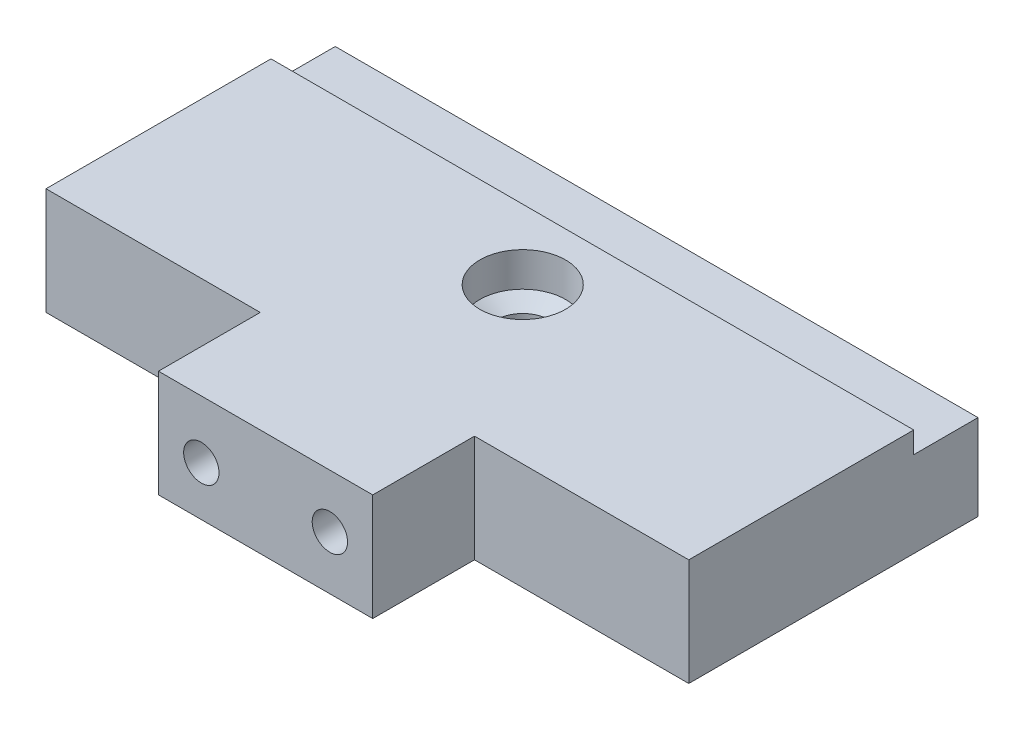
ISO-10303-21;
HEADER;
FILE_DESCRIPTION(('STEP AP214'),'2;1');
FILE_NAME('part.step','',(''),(''),'','','');
FILE_SCHEMA(('AUTOMOTIVE_DESIGN { 1 0 10303 214 1 1 1 1 }'));
ENDSEC;
DATA;
#1=APPLICATION_CONTEXT('core data for automotive mechanical design processes');
#2=APPLICATION_PROTOCOL_DEFINITION('international standard','automotive_design',2000,#1);
#3=PRODUCT_CONTEXT('',#1,'mechanical');
#4=PRODUCT('Part','Part','',(#3));
#5=PRODUCT_RELATED_PRODUCT_CATEGORY('part','',(#4));
#6=PRODUCT_DEFINITION_FORMATION('','',#4);
#7=PRODUCT_DEFINITION_CONTEXT('part definition',#1,'design');
#8=PRODUCT_DEFINITION('design','',#6,#7);
#9=PRODUCT_DEFINITION_SHAPE('','',#8);
#10=(LENGTH_UNIT() NAMED_UNIT(*) SI_UNIT(.MILLI.,.METRE.));
#11=(NAMED_UNIT(*) PLANE_ANGLE_UNIT() SI_UNIT($,.RADIAN.));
#12=(NAMED_UNIT(*) SI_UNIT($,.STERADIAN.) SOLID_ANGLE_UNIT());
#13=UNCERTAINTY_MEASURE_WITH_UNIT(LENGTH_MEASURE(1.E-05),#10,'distance_accuracy_value','');
#14=(GEOMETRIC_REPRESENTATION_CONTEXT(3) GLOBAL_UNCERTAINTY_ASSIGNED_CONTEXT((#13)) GLOBAL_UNIT_ASSIGNED_CONTEXT((#10,
#11,#12)) REPRESENTATION_CONTEXT('',''));
#15=CARTESIAN_POINT('',(0.,0.,0.));
#16=DIRECTION('',(0.,0.,1.));
#17=DIRECTION('',(1.,0.,0.));
#18=AXIS2_PLACEMENT_3D('',#15,#16,#17);
#19=CARTESIAN_POINT('',(0.,10.,0.));
#20=DIRECTION('',(0.,0.,-1.));
#21=DIRECTION('',(-1.,0.,0.));
#22=AXIS2_PLACEMENT_3D('',#19,#20,#21);
#23=PLANE('',#22);
#24=CARTESIAN_POINT('',(16.,5.00694727949025,0.));
#25=DIRECTION('',(0.,0.,1.));
#26=DIRECTION('',(1.,0.,0.));
#27=AXIS2_PLACEMENT_3D('',#24,#25,#26);
#28=CIRCLE('',#27,1.64999999999999);
#29=CARTESIAN_POINT('',(17.65,5.00694727949025,0.));
#30=VERTEX_POINT('',#29);
#31=EDGE_CURVE('E194',#30,#30,#28,.T.);
#32=ORIENTED_EDGE('',*,*,#31,.F.);
#33=EDGE_LOOP('',(#32));
#34=FACE_BOUND('',#33,.T.);
#35=CARTESIAN_POINT('',(4.,4.60497799052106,0.));
#36=DIRECTION('',(0.,0.,1.));
#37=DIRECTION('',(1.,0.,0.));
#38=AXIS2_PLACEMENT_3D('',#35,#36,#37);
#39=CIRCLE('',#38,1.64999999999999);
#40=CARTESIAN_POINT('',(5.64999999999999,4.60497799052106,0.));
#41=VERTEX_POINT('',#40);
#42=EDGE_CURVE('E188',#41,#41,#39,.T.);
#43=ORIENTED_EDGE('',*,*,#42,.F.);
#44=EDGE_LOOP('',(#43));
#45=FACE_BOUND('',#44,.T.);
#46=DIRECTION('',(1.,0.,0.));
#47=VECTOR('',#46,1.);
#48=CARTESIAN_POINT('',(0.,0.,0.));
#49=LINE('',#48,#47);
#50=CARTESIAN_POINT('',(0.,0.,0.));
#51=VERTEX_POINT('',#50);
#52=CARTESIAN_POINT('',(20.,0.,0.));
#53=VERTEX_POINT('',#52);
#54=EDGE_CURVE('E155',#51,#53,#49,.T.);
#55=ORIENTED_EDGE('',*,*,#54,.T.);
#56=DIRECTION('',(0.,-1.,0.));
#57=VECTOR('',#56,1.);
#58=CARTESIAN_POINT('',(20.,10.,0.));
#59=LINE('',#58,#57);
#60=CARTESIAN_POINT('',(20.,10.,0.));
#61=VERTEX_POINT('',#60);
#62=EDGE_CURVE('E11',#61,#53,#59,.T.);
#63=ORIENTED_EDGE('',*,*,#62,.F.);
#64=DIRECTION('',(1.,0.,0.));
#65=VECTOR('',#64,1.);
#66=CARTESIAN_POINT('',(0.,10.,0.));
#67=LINE('',#66,#65);
#68=CARTESIAN_POINT('',(0.,10.,0.));
#69=VERTEX_POINT('',#68);
#70=EDGE_CURVE('E148',#69,#61,#67,.T.);
#71=ORIENTED_EDGE('',*,*,#70,.F.);
#72=DIRECTION('',(0.,-1.,0.));
#73=VECTOR('',#72,1.);
#74=CARTESIAN_POINT('',(0.,10.,0.));
#75=LINE('',#74,#73);
#76=EDGE_CURVE('E62',#69,#51,#75,.T.);
#77=ORIENTED_EDGE('',*,*,#76,.T.);
#78=EDGE_LOOP('',(#55,#63,#71,#77));
#79=FACE_BOUND('',#78,.T.);
#80=ADVANCED_FACE('F38',(#34,#45,#79),#23,.F.);
#81=CARTESIAN_POINT('',(20.,10.,0.));
#82=DIRECTION('',(-1.,0.,0.));
#83=DIRECTION('',(0.,0.,1.));
#84=AXIS2_PLACEMENT_3D('',#81,#82,#83);
#85=PLANE('',#84);
#86=DIRECTION('',(0.,0.,-1.));
#87=VECTOR('',#86,1.);
#88=CARTESIAN_POINT('',(20.,0.,0.));
#89=LINE('',#88,#87);
#90=CARTESIAN_POINT('',(20.,0.,-9.50000000000001));
#91=VERTEX_POINT('',#90);
#92=EDGE_CURVE('E207',#53,#91,#89,.T.);
#93=ORIENTED_EDGE('',*,*,#92,.T.);
#94=DIRECTION('',(0.,-1.,0.));
#95=VECTOR('',#94,1.);
#96=CARTESIAN_POINT('',(20.,10.,-9.50000000000001));
#97=LINE('',#96,#95);
#98=CARTESIAN_POINT('',(20.,10.,-9.50000000000001));
#99=VERTEX_POINT('',#98);
#100=EDGE_CURVE('E46',#99,#91,#97,.T.);
#101=ORIENTED_EDGE('',*,*,#100,.F.);
#102=DIRECTION('',(0.,0.,-1.));
#103=VECTOR('',#102,1.);
#104=CARTESIAN_POINT('',(20.,10.,0.));
#105=LINE('',#104,#103);
#106=EDGE_CURVE('E95',#61,#99,#105,.T.);
#107=ORIENTED_EDGE('',*,*,#106,.F.);
#108=ORIENTED_EDGE('',*,*,#62,.T.);
#109=EDGE_LOOP('',(#93,#101,#107,#108));
#110=FACE_BOUND('',#109,.T.);
#111=ADVANCED_FACE('F202',(#110),#85,.F.);
#112=CARTESIAN_POINT('',(0.,10.,-9.50000000000001));
#113=DIRECTION('',(0.,0.,-1.));
#114=DIRECTION('',(-1.,0.,0.));
#115=AXIS2_PLACEMENT_3D('',#112,#113,#114);
#116=PLANE('',#115);
#117=DIRECTION('',(1.,0.,0.));
#118=VECTOR('',#117,1.);
#119=CARTESIAN_POINT('',(0.,0.,-9.50000000000001));
#120=LINE('',#119,#118);
#121=CARTESIAN_POINT('',(40.,0.,-9.50000000000002));
#122=VERTEX_POINT('',#121);
#123=EDGE_CURVE('E209',#91,#122,#120,.T.);
#124=ORIENTED_EDGE('',*,*,#123,.T.);
#125=DIRECTION('',(0.,-1.,0.));
#126=VECTOR('',#125,1.);
#127=CARTESIAN_POINT('',(40.,10.,-9.50000000000002));
#128=LINE('',#127,#126);
#129=CARTESIAN_POINT('',(40.,10.,-9.50000000000002));
#130=VERTEX_POINT('',#129);
#131=EDGE_CURVE('E225',#130,#122,#128,.T.);
#132=ORIENTED_EDGE('',*,*,#131,.F.);
#133=DIRECTION('',(1.,0.,0.));
#134=VECTOR('',#133,1.);
#135=CARTESIAN_POINT('',(0.,10.,-9.50000000000001));
#136=LINE('',#135,#134);
#137=EDGE_CURVE('E141',#99,#130,#136,.T.);
#138=ORIENTED_EDGE('',*,*,#137,.F.);
#139=ORIENTED_EDGE('',*,*,#100,.T.);
#140=EDGE_LOOP('',(#124,#132,#138,#139));
#141=FACE_BOUND('',#140,.T.);
#142=ADVANCED_FACE('F231',(#141),#116,.F.);
#143=CARTESIAN_POINT('',(40.,10.,0.));
#144=DIRECTION('',(-1.,0.,0.));
#145=DIRECTION('',(0.,0.,1.));
#146=AXIS2_PLACEMENT_3D('',#143,#144,#145);
#147=PLANE('',#146);
#148=DIRECTION('',(0.,0.,-1.));
#149=VECTOR('',#148,1.);
#150=CARTESIAN_POINT('',(40.,0.,0.));
#151=LINE('',#150,#149);
#152=CARTESIAN_POINT('',(40.,0.,-36.5));
#153=VERTEX_POINT('',#152);
#154=EDGE_CURVE('E213',#122,#153,#151,.T.);
#155=ORIENTED_EDGE('',*,*,#154,.T.);
#156=DIRECTION('',(0.,-1.,0.));
#157=VECTOR('',#156,1.);
#158=CARTESIAN_POINT('',(40.,8.,-36.5));
#159=LINE('',#158,#157);
#160=CARTESIAN_POINT('',(40.,8.,-36.5));
#161=VERTEX_POINT('',#160);
#162=EDGE_CURVE('E152',#161,#153,#159,.T.);
#163=ORIENTED_EDGE('',*,*,#162,.F.);
#164=DIRECTION('',(0.,0.,-1.));
#165=VECTOR('',#164,1.);
#166=CARTESIAN_POINT('',(40.,8.,0.));
#167=LINE('',#166,#165);
#168=CARTESIAN_POINT('',(40.,8.,-30.5));
#169=VERTEX_POINT('',#168);
#170=EDGE_CURVE('E167',#169,#161,#167,.T.);
#171=ORIENTED_EDGE('',*,*,#170,.F.);
#172=DIRECTION('',(0.,-1.,0.));
#173=VECTOR('',#172,1.);
#174=CARTESIAN_POINT('',(40.,10.,-30.5));
#175=LINE('',#174,#173);
#176=CARTESIAN_POINT('',(40.,10.,-30.5));
#177=VERTEX_POINT('',#176);
#178=EDGE_CURVE('E222',#177,#169,#175,.T.);
#179=ORIENTED_EDGE('',*,*,#178,.F.);
#180=DIRECTION('',(0.,0.,-1.));
#181=VECTOR('',#180,1.);
#182=CARTESIAN_POINT('',(40.,10.,0.));
#183=LINE('',#182,#181);
#184=EDGE_CURVE('E145',#130,#177,#183,.T.);
#185=ORIENTED_EDGE('',*,*,#184,.F.);
#186=ORIENTED_EDGE('',*,*,#131,.T.);
#187=EDGE_LOOP('',(#155,#163,#171,#179,#185,#186));
#188=FACE_BOUND('',#187,.T.);
#189=ADVANCED_FACE('F238',(#188),#147,.F.);
#190=CARTESIAN_POINT('',(0.,10.,-30.5));
#191=DIRECTION('',(0.,0.,1.));
#192=DIRECTION('',(1.,0.,0.));
#193=AXIS2_PLACEMENT_3D('',#190,#191,#192);
#194=PLANE('',#193);
#195=ORIENTED_EDGE('',*,*,#178,.T.);
#196=DIRECTION('',(-1.,0.,0.));
#197=VECTOR('',#196,1.);
#198=CARTESIAN_POINT('',(0.,8.,-30.5));
#199=LINE('',#198,#197);
#200=CARTESIAN_POINT('',(-20.,8.,-30.5));
#201=VERTEX_POINT('',#200);
#202=EDGE_CURVE('E161',#169,#201,#199,.T.);
#203=ORIENTED_EDGE('',*,*,#202,.T.);
#204=DIRECTION('',(0.,-1.,0.));
#205=VECTOR('',#204,1.);
#206=CARTESIAN_POINT('',(-20.,10.,-30.5));
#207=LINE('',#206,#205);
#208=CARTESIAN_POINT('',(-20.,10.,-30.5));
#209=VERTEX_POINT('',#208);
#210=EDGE_CURVE('E135',#209,#201,#207,.T.);
#211=ORIENTED_EDGE('',*,*,#210,.F.);
#212=DIRECTION('',(-1.,0.,0.));
#213=VECTOR('',#212,1.);
#214=CARTESIAN_POINT('',(0.,10.,-30.5));
#215=LINE('',#214,#213);
#216=EDGE_CURVE('E121',#177,#209,#215,.T.);
#217=ORIENTED_EDGE('',*,*,#216,.F.);
#218=EDGE_LOOP('',(#195,#203,#211,#217));
#219=FACE_BOUND('',#218,.T.);
#220=ADVANCED_FACE('F251',(#219),#194,.F.);
#221=CARTESIAN_POINT('',(-20.,10.,0.));
#222=DIRECTION('',(1.,0.,0.));
#223=DIRECTION('',(0.,0.,-1.));
#224=AXIS2_PLACEMENT_3D('',#221,#222,#223);
#225=PLANE('',#224);
#226=DIRECTION('',(0.,0.,1.));
#227=VECTOR('',#226,1.);
#228=CARTESIAN_POINT('',(-20.,0.,0.));
#229=LINE('',#228,#227);
#230=CARTESIAN_POINT('',(-20.,0.,-36.5));
#231=VERTEX_POINT('',#230);
#232=CARTESIAN_POINT('',(-20.,0.,-9.50000000000001));
#233=VERTEX_POINT('',#232);
#234=EDGE_CURVE('E131',#231,#233,#229,.T.);
#235=ORIENTED_EDGE('',*,*,#234,.T.);
#236=DIRECTION('',(0.,-1.,0.));
#237=VECTOR('',#236,1.);
#238=CARTESIAN_POINT('',(-20.,10.,-9.50000000000001));
#239=LINE('',#238,#237);
#240=CARTESIAN_POINT('',(-20.,10.,-9.50000000000001));
#241=VERTEX_POINT('',#240);
#242=EDGE_CURVE('E127',#241,#233,#239,.T.);
#243=ORIENTED_EDGE('',*,*,#242,.F.);
#244=DIRECTION('',(0.,0.,1.));
#245=VECTOR('',#244,1.);
#246=CARTESIAN_POINT('',(-20.,10.,0.));
#247=LINE('',#246,#245);
#248=EDGE_CURVE('E113',#209,#241,#247,.T.);
#249=ORIENTED_EDGE('',*,*,#248,.F.);
#250=ORIENTED_EDGE('',*,*,#210,.T.);
#251=DIRECTION('',(0.,0.,-1.));
#252=VECTOR('',#251,1.);
#253=CARTESIAN_POINT('',(-20.,8.,0.));
#254=LINE('',#253,#252);
#255=CARTESIAN_POINT('',(-20.,8.,-36.5));
#256=VERTEX_POINT('',#255);
#257=EDGE_CURVE('E53',#201,#256,#254,.T.);
#258=ORIENTED_EDGE('',*,*,#257,.T.);
#259=DIRECTION('',(0.,-1.,0.));
#260=VECTOR('',#259,1.);
#261=CARTESIAN_POINT('',(-20.,8.,-36.5));
#262=LINE('',#261,#260);
#263=EDGE_CURVE('E156',#256,#231,#262,.T.);
#264=ORIENTED_EDGE('',*,*,#263,.T.);
#265=EDGE_LOOP('',(#235,#243,#249,#250,#258,#264));
#266=FACE_BOUND('',#265,.T.);
#267=ADVANCED_FACE('F128',(#266),#225,.F.);
#268=CARTESIAN_POINT('',(0.,0.,-9.50000000000001));
#269=VERTEX_POINT('',#268);
#270=EDGE_CURVE('E214',#233,#269,#120,.T.);
#271=ORIENTED_EDGE('',*,*,#270,.T.);
#272=DIRECTION('',(0.,-1.,0.));
#273=VECTOR('',#272,1.);
#274=CARTESIAN_POINT('',(0.,10.,-9.50000000000001));
#275=LINE('',#274,#273);
#276=CARTESIAN_POINT('',(0.,10.,-9.50000000000001));
#277=VERTEX_POINT('',#276);
#278=EDGE_CURVE('E136',#277,#269,#275,.T.);
#279=ORIENTED_EDGE('',*,*,#278,.F.);
#280=EDGE_CURVE('E118',#241,#277,#136,.T.);
#281=ORIENTED_EDGE('',*,*,#280,.F.);
#282=ORIENTED_EDGE('',*,*,#242,.T.);
#283=EDGE_LOOP('',(#271,#279,#281,#282));
#284=FACE_BOUND('',#283,.T.);
#285=ADVANCED_FACE('F138',(#284),#116,.F.);
#286=CARTESIAN_POINT('',(0.,10.,0.));
#287=DIRECTION('',(-1.,0.,0.));
#288=DIRECTION('',(0.,0.,1.));
#289=AXIS2_PLACEMENT_3D('',#286,#287,#288);
#290=PLANE('',#289);
#291=DIRECTION('',(0.,0.,-1.));
#292=VECTOR('',#291,1.);
#293=CARTESIAN_POINT('',(0.,0.,0.));
#294=LINE('',#293,#292);
#295=EDGE_CURVE('E149',#51,#269,#294,.T.);
#296=ORIENTED_EDGE('',*,*,#295,.F.);
#297=ORIENTED_EDGE('',*,*,#76,.F.);
#298=DIRECTION('',(0.,0.,-1.));
#299=VECTOR('',#298,1.);
#300=CARTESIAN_POINT('',(0.,10.,0.));
#301=LINE('',#300,#299);
#302=EDGE_CURVE('E139',#69,#277,#301,.T.);
#303=ORIENTED_EDGE('',*,*,#302,.T.);
#304=ORIENTED_EDGE('',*,*,#278,.T.);
#305=EDGE_LOOP('',(#296,#297,#303,#304));
#306=FACE_BOUND('',#305,.T.);
#307=ADVANCED_FACE('F305',(#306),#290,.T.);
#308=CARTESIAN_POINT('',(0.,10.,0.));
#309=DIRECTION('',(0.,1.,0.));
#310=DIRECTION('',(0.,0.,1.));
#311=AXIS2_PLACEMENT_3D('',#308,#309,#310);
#312=PLANE('',#311);
#313=CARTESIAN_POINT('',(9.99999999999999,10.,-24.));
#314=DIRECTION('',(0.,1.,0.));
#315=DIRECTION('',(0.,0.,1.));
#316=AXIS2_PLACEMENT_3D('',#313,#314,#315);
#317=CIRCLE('',#316,3.99999999999999);
#318=CARTESIAN_POINT('',(9.99999999999999,10.,-20.));
#319=VERTEX_POINT('',#318);
#320=EDGE_CURVE('E173',#319,#319,#317,.T.);
#321=ORIENTED_EDGE('',*,*,#320,.F.);
#322=EDGE_LOOP('',(#321));
#323=FACE_BOUND('',#322,.T.);
#324=ORIENTED_EDGE('',*,*,#70,.T.);
#325=ORIENTED_EDGE('',*,*,#106,.T.);
#326=ORIENTED_EDGE('',*,*,#137,.T.);
#327=ORIENTED_EDGE('',*,*,#184,.T.);
#328=ORIENTED_EDGE('',*,*,#216,.T.);
#329=ORIENTED_EDGE('',*,*,#248,.T.);
#330=ORIENTED_EDGE('',*,*,#280,.T.);
#331=ORIENTED_EDGE('',*,*,#302,.F.);
#332=EDGE_LOOP('',(#324,#325,#326,#327,#328,#329,#330,#331));
#333=FACE_BOUND('',#332,.T.);
#334=ADVANCED_FACE('F115',(#323,#333),#312,.T.);
#335=CARTESIAN_POINT('',(0.,0.,0.));
#336=DIRECTION('',(0.,1.,0.));
#337=DIRECTION('',(0.,0.,1.));
#338=AXIS2_PLACEMENT_3D('',#335,#336,#337);
#339=PLANE('',#338);
#340=CARTESIAN_POINT('',(9.99999999999999,0.,-24.));
#341=DIRECTION('',(0.,-1.,0.));
#342=DIRECTION('',(0.,0.,-1.));
#343=AXIS2_PLACEMENT_3D('',#340,#341,#342);
#344=CIRCLE('',#343,3.99999999999999);
#345=CARTESIAN_POINT('',(9.99999999999999,0.,-28.));
#346=VERTEX_POINT('',#345);
#347=EDGE_CURVE('E179',#346,#346,#344,.T.);
#348=ORIENTED_EDGE('',*,*,#347,.F.);
#349=EDGE_LOOP('',(#348));
#350=FACE_BOUND('',#349,.T.);
#351=ORIENTED_EDGE('',*,*,#54,.F.);
#352=ORIENTED_EDGE('',*,*,#295,.T.);
#353=ORIENTED_EDGE('',*,*,#270,.F.);
#354=ORIENTED_EDGE('',*,*,#234,.F.);
#355=DIRECTION('',(1.,0.,0.));
#356=VECTOR('',#355,1.);
#357=CARTESIAN_POINT('',(0.,0.,-36.5));
#358=LINE('',#357,#356);
#359=EDGE_CURVE('E158',#231,#153,#358,.T.);
#360=ORIENTED_EDGE('',*,*,#359,.T.);
#361=ORIENTED_EDGE('',*,*,#154,.F.);
#362=ORIENTED_EDGE('',*,*,#123,.F.);
#363=ORIENTED_EDGE('',*,*,#92,.F.);
#364=EDGE_LOOP('',(#351,#352,#353,#354,#360,#361,#362,#363));
#365=FACE_BOUND('',#364,.T.);
#366=ADVANCED_FACE('F233',(#350,#365),#339,.F.);
#367=CARTESIAN_POINT('',(0.,8.,-36.5));
#368=DIRECTION('',(0.,0.,-1.));
#369=DIRECTION('',(-1.,0.,0.));
#370=AXIS2_PLACEMENT_3D('',#367,#368,#369);
#371=PLANE('',#370);
#372=ORIENTED_EDGE('',*,*,#359,.F.);
#373=ORIENTED_EDGE('',*,*,#263,.F.);
#374=DIRECTION('',(1.,0.,0.));
#375=VECTOR('',#374,1.);
#376=CARTESIAN_POINT('',(0.,8.,-36.5));
#377=LINE('',#376,#375);
#378=EDGE_CURVE('E164',#256,#161,#377,.T.);
#379=ORIENTED_EDGE('',*,*,#378,.T.);
#380=ORIENTED_EDGE('',*,*,#162,.T.);
#381=EDGE_LOOP('',(#372,#373,#379,#380));
#382=FACE_BOUND('',#381,.T.);
#383=ADVANCED_FACE('F244',(#382),#371,.T.);
#384=CARTESIAN_POINT('',(0.,8.,0.));
#385=DIRECTION('',(0.,1.,0.));
#386=DIRECTION('',(0.,0.,1.));
#387=AXIS2_PLACEMENT_3D('',#384,#385,#386);
#388=PLANE('',#387);
#389=ORIENTED_EDGE('',*,*,#202,.F.);
#390=ORIENTED_EDGE('',*,*,#170,.T.);
#391=ORIENTED_EDGE('',*,*,#378,.F.);
#392=ORIENTED_EDGE('',*,*,#257,.F.);
#393=EDGE_LOOP('',(#389,#390,#391,#392));
#394=FACE_BOUND('',#393,.T.);
#395=ADVANCED_FACE('F248',(#394),#388,.T.);
#396=CARTESIAN_POINT('',(9.99999999999999,6.8,-24.));
#397=DIRECTION('',(0.,1.,0.));
#398=DIRECTION('',(0.,0.,1.));
#399=AXIS2_PLACEMENT_3D('',#396,#397,#398);
#400=CONICAL_SURFACE('',#399,3.99999999999999,1.02974425867666);
#401=CARTESIAN_POINT('',(9.99999999999999,5.89870907145867,-24.));
#402=DIRECTION('',(0.,1.,0.));
#403=DIRECTION('',(0.,0.,1.));
#404=AXIS2_PLACEMENT_3D('',#401,#402,#403);
#405=CIRCLE('',#404,2.49999999999999);
#406=CARTESIAN_POINT('',(9.99999999999999,5.89870907145867,-21.5));
#407=VERTEX_POINT('',#406);
#408=EDGE_CURVE('E41',#407,#407,#405,.F.);
#409=ORIENTED_EDGE('',*,*,#408,.T.);
#410=EDGE_LOOP('',(#409));
#411=FACE_BOUND('',#410,.T.);
#412=CARTESIAN_POINT('',(9.99999999999999,6.8,-24.));
#413=DIRECTION('',(0.,1.,0.));
#414=DIRECTION('',(0.,0.,1.));
#415=AXIS2_PLACEMENT_3D('',#412,#413,#414);
#416=CIRCLE('',#415,3.99999999999999);
#417=CARTESIAN_POINT('',(9.99999999999999,6.8,-20.));
#418=VERTEX_POINT('',#417);
#419=EDGE_CURVE('E162',#418,#418,#416,.T.);
#420=ORIENTED_EDGE('',*,*,#419,.T.);
#421=EDGE_LOOP('',(#420));
#422=FACE_BOUND('',#421,.T.);
#423=ADVANCED_FACE('F294',(#411,#422),#400,.F.);
#424=CARTESIAN_POINT('',(9.99999999999999,10.,-24.));
#425=DIRECTION('',(0.,1.,0.));
#426=DIRECTION('',(0.,0.,1.));
#427=AXIS2_PLACEMENT_3D('',#424,#425,#426);
#428=CYLINDRICAL_SURFACE('',#427,3.99999999999999);
#429=ORIENTED_EDGE('',*,*,#419,.F.);
#430=EDGE_LOOP('',(#429));
#431=FACE_BOUND('',#430,.T.);
#432=ORIENTED_EDGE('',*,*,#320,.T.);
#433=EDGE_LOOP('',(#432));
#434=FACE_BOUND('',#433,.T.);
#435=ADVANCED_FACE('F290',(#431,#434),#428,.F.);
#436=CARTESIAN_POINT('',(9.99999999999999,3.,-24.));
#437=DIRECTION('',(0.,-1.,0.));
#438=DIRECTION('',(0.,0.,-1.));
#439=AXIS2_PLACEMENT_3D('',#436,#437,#438);
#440=CONICAL_SURFACE('',#439,4.,1.02974425867665);
#441=CARTESIAN_POINT('',(9.99999999999999,3.90129092854135,-24.));
#442=DIRECTION('',(0.,-1.,0.));
#443=DIRECTION('',(0.,0.,-1.));
#444=AXIS2_PLACEMENT_3D('',#441,#442,#443);
#445=CIRCLE('',#444,2.49999999999999);
#446=CARTESIAN_POINT('',(9.99999999999999,3.90129092854135,-26.5));
#447=VERTEX_POINT('',#446);
#448=EDGE_CURVE('E182',#447,#447,#445,.F.);
#449=ORIENTED_EDGE('',*,*,#448,.T.);
#450=EDGE_LOOP('',(#449));
#451=FACE_BOUND('',#450,.T.);
#452=CARTESIAN_POINT('',(9.99999999999999,3.,-24.));
#453=DIRECTION('',(0.,-1.,0.));
#454=DIRECTION('',(0.,0.,-1.));
#455=AXIS2_PLACEMENT_3D('',#452,#453,#454);
#456=CIRCLE('',#455,4.);
#457=CARTESIAN_POINT('',(9.99999999999999,3.,-28.));
#458=VERTEX_POINT('',#457);
#459=EDGE_CURVE('E176',#458,#458,#456,.T.);
#460=ORIENTED_EDGE('',*,*,#459,.T.);
#461=EDGE_LOOP('',(#460));
#462=FACE_BOUND('',#461,.T.);
#463=ADVANCED_FACE('F286',(#451,#462),#440,.F.);
#464=CARTESIAN_POINT('',(9.99999999999999,0.,-24.));
#465=DIRECTION('',(0.,-1.,0.));
#466=DIRECTION('',(0.,0.,-1.));
#467=AXIS2_PLACEMENT_3D('',#464,#465,#466);
#468=CYLINDRICAL_SURFACE('',#467,3.99999999999999);
#469=ORIENTED_EDGE('',*,*,#459,.F.);
#470=EDGE_LOOP('',(#469));
#471=FACE_BOUND('',#470,.T.);
#472=ORIENTED_EDGE('',*,*,#347,.T.);
#473=EDGE_LOOP('',(#472));
#474=FACE_BOUND('',#473,.T.);
#475=ADVANCED_FACE('F282',(#471,#474),#468,.F.);
#476=CARTESIAN_POINT('',(9.99999999999999,0.,-24.));
#477=DIRECTION('',(0.,-1.,0.));
#478=DIRECTION('',(0.,0.,-1.));
#479=AXIS2_PLACEMENT_3D('',#476,#477,#478);
#480=CYLINDRICAL_SURFACE('',#479,2.49999999999999);
#481=ORIENTED_EDGE('',*,*,#408,.F.);
#482=EDGE_LOOP('',(#481));
#483=FACE_BOUND('',#482,.T.);
#484=ORIENTED_EDGE('',*,*,#448,.F.);
#485=EDGE_LOOP('',(#484));
#486=FACE_BOUND('',#485,.T.);
#487=ADVANCED_FACE('F278',(#483,#486),#480,.F.);
#488=CARTESIAN_POINT('',(4.,4.60497799052106,-10.1));
#489=DIRECTION('',(0.,0.,1.));
#490=DIRECTION('',(1.,0.,0.));
#491=AXIS2_PLACEMENT_3D('',#488,#489,#490);
#492=CONICAL_SURFACE('',#491,1.64999999999999,1.02974425867665);
#493=CARTESIAN_POINT('',(4.,4.60497799052106,-11.0914200213955));
#494=VERTEX_POINT('',#493);
#495=VERTEX_LOOP('',#494);
#496=FACE_BOUND('',#495,.T.);
#497=CARTESIAN_POINT('',(4.,4.60497799052106,-10.1));
#498=DIRECTION('',(0.,0.,1.));
#499=DIRECTION('',(1.,0.,0.));
#500=AXIS2_PLACEMENT_3D('',#497,#498,#499);
#501=CIRCLE('',#500,1.64999999999999);
#502=CARTESIAN_POINT('',(5.64999999999999,4.60497799052106,-10.1));
#503=VERTEX_POINT('',#502);
#504=EDGE_CURVE('E185',#503,#503,#501,.T.);
#505=ORIENTED_EDGE('',*,*,#504,.T.);
#506=EDGE_LOOP('',(#505));
#507=FACE_BOUND('',#506,.T.);
#508=ADVANCED_FACE('F274',(#496,#507),#492,.F.);
#509=CARTESIAN_POINT('',(4.,4.60497799052106,0.));
#510=DIRECTION('',(0.,0.,1.));
#511=DIRECTION('',(1.,0.,0.));
#512=AXIS2_PLACEMENT_3D('',#509,#510,#511);
#513=CYLINDRICAL_SURFACE('',#512,1.64999999999999);
#514=ORIENTED_EDGE('',*,*,#504,.F.);
#515=EDGE_LOOP('',(#514));
#516=FACE_BOUND('',#515,.T.);
#517=ORIENTED_EDGE('',*,*,#42,.T.);
#518=EDGE_LOOP('',(#517));
#519=FACE_BOUND('',#518,.T.);
#520=ADVANCED_FACE('F263',(#516,#519),#513,.F.);
#521=CARTESIAN_POINT('',(16.,5.00694727949025,-10.1));
#522=DIRECTION('',(0.,0.,1.));
#523=DIRECTION('',(1.,0.,0.));
#524=AXIS2_PLACEMENT_3D('',#521,#522,#523);
#525=CONICAL_SURFACE('',#524,1.64999999999999,1.02974425867665);
#526=CARTESIAN_POINT('',(16.,5.00694727949025,-11.0914200213955));
#527=VERTEX_POINT('',#526);
#528=VERTEX_LOOP('',#527);
#529=FACE_BOUND('',#528,.T.);
#530=CARTESIAN_POINT('',(16.,5.00694727949025,-10.1));
#531=DIRECTION('',(0.,0.,1.));
#532=DIRECTION('',(1.,0.,0.));
#533=AXIS2_PLACEMENT_3D('',#530,#531,#532);
#534=CIRCLE('',#533,1.64999999999999);
#535=CARTESIAN_POINT('',(17.65,5.00694727949025,-10.1));
#536=VERTEX_POINT('',#535);
#537=EDGE_CURVE('E191',#536,#536,#534,.T.);
#538=ORIENTED_EDGE('',*,*,#537,.T.);
#539=EDGE_LOOP('',(#538));
#540=FACE_BOUND('',#539,.T.);
#541=ADVANCED_FACE('F260',(#529,#540),#525,.F.);
#542=CARTESIAN_POINT('',(16.,5.00694727949025,0.));
#543=DIRECTION('',(0.,0.,1.));
#544=DIRECTION('',(1.,0.,0.));
#545=AXIS2_PLACEMENT_3D('',#542,#543,#544);
#546=CYLINDRICAL_SURFACE('',#545,1.64999999999999);
#547=ORIENTED_EDGE('',*,*,#537,.F.);
#548=EDGE_LOOP('',(#547));
#549=FACE_BOUND('',#548,.T.);
#550=ORIENTED_EDGE('',*,*,#31,.T.);
#551=EDGE_LOOP('',(#550));
#552=FACE_BOUND('',#551,.T.);
#553=ADVANCED_FACE('F198',(#549,#552),#546,.F.);
#554=CLOSED_SHELL('',(#80,#111,#142,#189,#220,#267,#285,#307,#334,#366,#383,#395,#423,#435,#463,
#475,#487,#508,#520,#541,#553));
#555=MANIFOLD_SOLID_BREP('B2',#554);
#556=ADVANCED_BREP_SHAPE_REPRESENTATION('',(#18,#555),#14);
#557=SHAPE_DEFINITION_REPRESENTATION(#9,#556);
ENDSEC;
END-ISO-10303-21;
